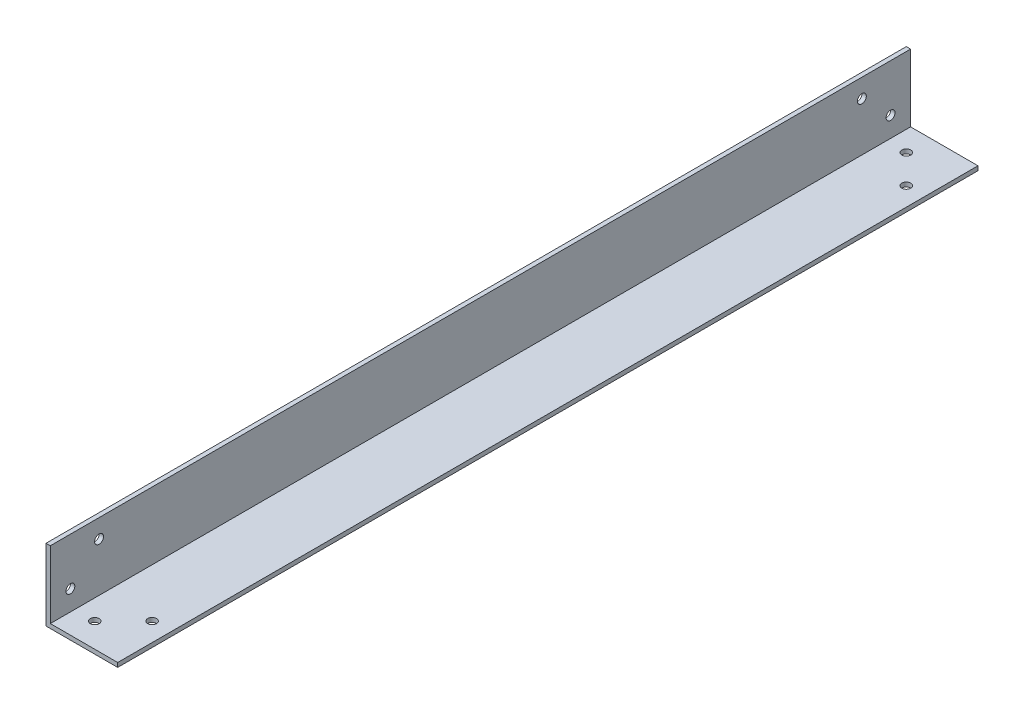
ISO-10303-21;
HEADER;
FILE_DESCRIPTION(('STEP AP214'),'2;1');
FILE_NAME('part.step','',(''),(''),'','','');
FILE_SCHEMA(('AUTOMOTIVE_DESIGN { 1 0 10303 214 1 1 1 1 }'));
ENDSEC;
DATA;
#1=APPLICATION_CONTEXT('core data for automotive mechanical design processes');
#2=APPLICATION_PROTOCOL_DEFINITION('international standard','automotive_design',2000,#1);
#3=PRODUCT_CONTEXT('',#1,'mechanical');
#4=PRODUCT('Part','Part','',(#3));
#5=PRODUCT_RELATED_PRODUCT_CATEGORY('part','',(#4));
#6=PRODUCT_DEFINITION_FORMATION('','',#4);
#7=PRODUCT_DEFINITION_CONTEXT('part definition',#1,'design');
#8=PRODUCT_DEFINITION('design','',#6,#7);
#9=PRODUCT_DEFINITION_SHAPE('','',#8);
#10=(LENGTH_UNIT() NAMED_UNIT(*) SI_UNIT(.MILLI.,.METRE.));
#11=(NAMED_UNIT(*) PLANE_ANGLE_UNIT() SI_UNIT($,.RADIAN.));
#12=(NAMED_UNIT(*) SI_UNIT($,.STERADIAN.) SOLID_ANGLE_UNIT());
#13=UNCERTAINTY_MEASURE_WITH_UNIT(LENGTH_MEASURE(1.E-05),#10,'distance_accuracy_value','');
#14=(GEOMETRIC_REPRESENTATION_CONTEXT(3) GLOBAL_UNCERTAINTY_ASSIGNED_CONTEXT((#13)) GLOBAL_UNIT_ASSIGNED_CONTEXT((#10,
#11,#12)) REPRESENTATION_CONTEXT('',''));
#15=CARTESIAN_POINT('',(0.,0.,0.));
#16=DIRECTION('',(0.,0.,1.));
#17=DIRECTION('',(1.,0.,0.));
#18=AXIS2_PLACEMENT_3D('',#15,#16,#17);
#19=CARTESIAN_POINT('',(25.,0.,300.));
#20=DIRECTION('',(0.,1.,0.));
#21=DIRECTION('',(-1.,0.,0.));
#22=AXIS2_PLACEMENT_3D('',#19,#20,#21);
#23=PLANE('',#22);
#24=CARTESIAN_POINT('',(8.50000000000004,0.,8.50000000000001));
#25=DIRECTION('',(0.,-1.,0.));
#26=DIRECTION('',(1.,0.,0.));
#27=AXIS2_PLACEMENT_3D('',#24,#25,#26);
#28=CIRCLE('',#27,1.55);
#29=CARTESIAN_POINT('',(10.05,0.,8.50000000000001));
#30=VERTEX_POINT('',#29);
#31=EDGE_CURVE('E155',#30,#30,#28,.T.);
#32=ORIENTED_EDGE('',*,*,#31,.F.);
#33=EDGE_LOOP('',(#32));
#34=FACE_BOUND('',#33,.T.);
#35=CARTESIAN_POINT('',(18.5,0.,18.5));
#36=DIRECTION('',(0.,-1.,0.));
#37=DIRECTION('',(1.,0.,0.));
#38=AXIS2_PLACEMENT_3D('',#35,#36,#37);
#39=CIRCLE('',#38,1.55);
#40=CARTESIAN_POINT('',(20.05,0.,18.5));
#41=VERTEX_POINT('',#40);
#42=EDGE_CURVE('E145',#41,#41,#39,.T.);
#43=ORIENTED_EDGE('',*,*,#42,.F.);
#44=EDGE_LOOP('',(#43));
#45=FACE_BOUND('',#44,.T.);
#46=CARTESIAN_POINT('',(8.5,0.,291.5));
#47=DIRECTION('',(0.,-1.,0.));
#48=DIRECTION('',(1.,0.,0.));
#49=AXIS2_PLACEMENT_3D('',#46,#47,#48);
#50=CIRCLE('',#49,1.55000000000002);
#51=CARTESIAN_POINT('',(10.05,0.,291.5));
#52=VERTEX_POINT('',#51);
#53=EDGE_CURVE('E142',#52,#52,#50,.T.);
#54=ORIENTED_EDGE('',*,*,#53,.F.);
#55=EDGE_LOOP('',(#54));
#56=FACE_BOUND('',#55,.T.);
#57=CARTESIAN_POINT('',(18.5,0.,281.5));
#58=DIRECTION('',(0.,-1.,0.));
#59=DIRECTION('',(1.,0.,0.));
#60=AXIS2_PLACEMENT_3D('',#57,#58,#59);
#61=CIRCLE('',#60,1.55000000000002);
#62=CARTESIAN_POINT('',(20.05,0.,281.5));
#63=VERTEX_POINT('',#62);
#64=EDGE_CURVE('E139',#63,#63,#61,.T.);
#65=ORIENTED_EDGE('',*,*,#64,.F.);
#66=EDGE_LOOP('',(#65));
#67=FACE_BOUND('',#66,.T.);
#68=DIRECTION('',(1.,0.,0.));
#69=VECTOR('',#68,1.);
#70=CARTESIAN_POINT('',(25.,0.,0.));
#71=LINE('',#70,#69);
#72=CARTESIAN_POINT('',(0.,0.,0.));
#73=VERTEX_POINT('',#72);
#74=CARTESIAN_POINT('',(25.,0.,0.));
#75=VERTEX_POINT('',#74);
#76=EDGE_CURVE('E118',#73,#75,#71,.T.);
#77=ORIENTED_EDGE('',*,*,#76,.T.);
#78=DIRECTION('',(0.,0.,-1.));
#79=VECTOR('',#78,1.);
#80=CARTESIAN_POINT('',(25.,0.,300.));
#81=LINE('',#80,#79);
#82=CARTESIAN_POINT('',(25.,0.,300.));
#83=VERTEX_POINT('',#82);
#84=EDGE_CURVE('E11',#83,#75,#81,.T.);
#85=ORIENTED_EDGE('',*,*,#84,.F.);
#86=DIRECTION('',(1.,0.,0.));
#87=VECTOR('',#86,1.);
#88=CARTESIAN_POINT('',(25.,0.,300.));
#89=LINE('',#88,#87);
#90=CARTESIAN_POINT('',(0.,0.,300.));
#91=VERTEX_POINT('',#90);
#92=EDGE_CURVE('E129',#91,#83,#89,.T.);
#93=ORIENTED_EDGE('',*,*,#92,.F.);
#94=DIRECTION('',(0.,0.,-1.));
#95=VECTOR('',#94,1.);
#96=CARTESIAN_POINT('',(0.,0.,300.));
#97=LINE('',#96,#95);
#98=EDGE_CURVE('E114',#91,#73,#97,.T.);
#99=ORIENTED_EDGE('',*,*,#98,.T.);
#100=EDGE_LOOP('',(#77,#85,#93,#99));
#101=FACE_BOUND('',#100,.T.);
#102=ADVANCED_FACE('F32',(#34,#45,#56,#67,#101),#23,.F.);
#103=CARTESIAN_POINT('',(25.,1.5,300.));
#104=DIRECTION('',(-1.,0.,0.));
#105=DIRECTION('',(0.,0.,1.));
#106=AXIS2_PLACEMENT_3D('',#103,#104,#105);
#107=PLANE('',#106);
#108=DIRECTION('',(0.,1.,0.));
#109=VECTOR('',#108,1.);
#110=CARTESIAN_POINT('',(25.,1.5,0.));
#111=LINE('',#110,#109);
#112=CARTESIAN_POINT('',(25.,1.5,0.));
#113=VERTEX_POINT('',#112);
#114=EDGE_CURVE('E121',#75,#113,#111,.T.);
#115=ORIENTED_EDGE('',*,*,#114,.T.);
#116=DIRECTION('',(0.,0.,-1.));
#117=VECTOR('',#116,1.);
#118=CARTESIAN_POINT('',(25.,1.5,300.));
#119=LINE('',#118,#117);
#120=CARTESIAN_POINT('',(25.,1.5,300.));
#121=VERTEX_POINT('',#120);
#122=EDGE_CURVE('E41',#121,#113,#119,.T.);
#123=ORIENTED_EDGE('',*,*,#122,.F.);
#124=DIRECTION('',(0.,1.,0.));
#125=VECTOR('',#124,1.);
#126=CARTESIAN_POINT('',(25.,1.5,300.));
#127=LINE('',#126,#125);
#128=EDGE_CURVE('E87',#83,#121,#127,.T.);
#129=ORIENTED_EDGE('',*,*,#128,.F.);
#130=ORIENTED_EDGE('',*,*,#84,.T.);
#131=EDGE_LOOP('',(#115,#123,#129,#130));
#132=FACE_BOUND('',#131,.T.);
#133=ADVANCED_FACE('F185',(#132),#107,.F.);
#134=CARTESIAN_POINT('',(1.5,1.5,300.));
#135=DIRECTION('',(0.,-1.,0.));
#136=DIRECTION('',(1.,0.,0.));
#137=AXIS2_PLACEMENT_3D('',#134,#135,#136);
#138=PLANE('',#137);
#139=CARTESIAN_POINT('',(8.50000000000004,1.5,8.50000000000001));
#140=DIRECTION('',(0.,-1.,0.));
#141=DIRECTION('',(1.,0.,0.));
#142=AXIS2_PLACEMENT_3D('',#139,#140,#141);
#143=CIRCLE('',#142,1.55);
#144=CARTESIAN_POINT('',(10.05,1.5,8.50000000000001));
#145=VERTEX_POINT('',#144);
#146=EDGE_CURVE('E35',#145,#145,#143,.T.);
#147=ORIENTED_EDGE('',*,*,#146,.T.);
#148=EDGE_LOOP('',(#147));
#149=FACE_BOUND('',#148,.T.);
#150=CARTESIAN_POINT('',(18.5,1.5,18.5));
#151=DIRECTION('',(0.,-1.,0.));
#152=DIRECTION('',(1.,0.,0.));
#153=AXIS2_PLACEMENT_3D('',#150,#151,#152);
#154=CIRCLE('',#153,1.55);
#155=CARTESIAN_POINT('',(20.05,1.5,18.5));
#156=VERTEX_POINT('',#155);
#157=EDGE_CURVE('E143',#156,#156,#154,.T.);
#158=ORIENTED_EDGE('',*,*,#157,.T.);
#159=EDGE_LOOP('',(#158));
#160=FACE_BOUND('',#159,.T.);
#161=CARTESIAN_POINT('',(8.5,1.5,291.5));
#162=DIRECTION('',(0.,-1.,0.));
#163=DIRECTION('',(1.,0.,0.));
#164=AXIS2_PLACEMENT_3D('',#161,#162,#163);
#165=CIRCLE('',#164,1.55000000000002);
#166=CARTESIAN_POINT('',(10.05,1.5,291.5));
#167=VERTEX_POINT('',#166);
#168=EDGE_CURVE('E140',#167,#167,#165,.T.);
#169=ORIENTED_EDGE('',*,*,#168,.T.);
#170=EDGE_LOOP('',(#169));
#171=FACE_BOUND('',#170,.T.);
#172=CARTESIAN_POINT('',(18.5,1.5,281.5));
#173=DIRECTION('',(0.,-1.,0.));
#174=DIRECTION('',(1.,0.,0.));
#175=AXIS2_PLACEMENT_3D('',#172,#173,#174);
#176=CIRCLE('',#175,1.55000000000002);
#177=CARTESIAN_POINT('',(20.05,1.5,281.5));
#178=VERTEX_POINT('',#177);
#179=EDGE_CURVE('E135',#178,#178,#176,.T.);
#180=ORIENTED_EDGE('',*,*,#179,.T.);
#181=EDGE_LOOP('',(#180));
#182=FACE_BOUND('',#181,.T.);
#183=DIRECTION('',(-1.,0.,0.));
#184=VECTOR('',#183,1.);
#185=CARTESIAN_POINT('',(1.5,1.5,0.));
#186=LINE('',#185,#184);
#187=CARTESIAN_POINT('',(1.5,1.5,0.));
#188=VERTEX_POINT('',#187);
#189=EDGE_CURVE('E124',#113,#188,#186,.T.);
#190=ORIENTED_EDGE('',*,*,#189,.T.);
#191=DIRECTION('',(0.,0.,-1.));
#192=VECTOR('',#191,1.);
#193=CARTESIAN_POINT('',(1.5,1.5,300.));
#194=LINE('',#193,#192);
#195=CARTESIAN_POINT('',(1.5,1.5,300.));
#196=VERTEX_POINT('',#195);
#197=EDGE_CURVE('E109',#196,#188,#194,.T.);
#198=ORIENTED_EDGE('',*,*,#197,.F.);
#199=DIRECTION('',(-1.,0.,0.));
#200=VECTOR('',#199,1.);
#201=CARTESIAN_POINT('',(1.5,1.5,300.));
#202=LINE('',#201,#200);
#203=EDGE_CURVE('E100',#121,#196,#202,.T.);
#204=ORIENTED_EDGE('',*,*,#203,.F.);
#205=ORIENTED_EDGE('',*,*,#122,.T.);
#206=EDGE_LOOP('',(#190,#198,#204,#205));
#207=FACE_BOUND('',#206,.T.);
#208=ADVANCED_FACE('F188',(#149,#160,#171,#182,#207),#138,.F.);
#209=CARTESIAN_POINT('',(1.5,25.,300.));
#210=DIRECTION('',(-1.,0.,0.));
#211=DIRECTION('',(0.,-1.,0.));
#212=AXIS2_PLACEMENT_3D('',#209,#210,#211);
#213=PLANE('',#212);
#214=CARTESIAN_POINT('',(1.5,8.49999999999997,7.00000000000001));
#215=DIRECTION('',(-1.,0.,0.));
#216=DIRECTION('',(0.,-1.,0.));
#217=AXIS2_PLACEMENT_3D('',#214,#215,#216);
#218=CIRCLE('',#217,1.55);
#219=CARTESIAN_POINT('',(1.5,6.94999999999996,7.00000000000001));
#220=VERTEX_POINT('',#219);
#221=EDGE_CURVE('E162',#220,#220,#218,.T.);
#222=ORIENTED_EDGE('',*,*,#221,.T.);
#223=EDGE_LOOP('',(#222));
#224=FACE_BOUND('',#223,.T.);
#225=CARTESIAN_POINT('',(1.5,18.5,17.));
#226=DIRECTION('',(-1.,0.,0.));
#227=DIRECTION('',(0.,-1.,0.));
#228=AXIS2_PLACEMENT_3D('',#225,#226,#227);
#229=CIRCLE('',#228,1.55);
#230=CARTESIAN_POINT('',(1.5,16.95,17.));
#231=VERTEX_POINT('',#230);
#232=EDGE_CURVE('E168',#231,#231,#229,.T.);
#233=ORIENTED_EDGE('',*,*,#232,.T.);
#234=EDGE_LOOP('',(#233));
#235=FACE_BOUND('',#234,.T.);
#236=CARTESIAN_POINT('',(1.5,8.5,293.));
#237=DIRECTION('',(-1.,0.,0.));
#238=DIRECTION('',(0.,-1.,0.));
#239=AXIS2_PLACEMENT_3D('',#236,#237,#238);
#240=CIRCLE('',#239,1.54999999999999);
#241=CARTESIAN_POINT('',(1.5,6.95000000000001,293.));
#242=VERTEX_POINT('',#241);
#243=EDGE_CURVE('E174',#242,#242,#240,.T.);
#244=ORIENTED_EDGE('',*,*,#243,.T.);
#245=EDGE_LOOP('',(#244));
#246=FACE_BOUND('',#245,.T.);
#247=CARTESIAN_POINT('',(1.5,18.5,283.));
#248=DIRECTION('',(-1.,0.,0.));
#249=DIRECTION('',(0.,-1.,0.));
#250=AXIS2_PLACEMENT_3D('',#247,#248,#249);
#251=CIRCLE('',#250,1.54999999999999);
#252=CARTESIAN_POINT('',(1.5,16.95,283.));
#253=VERTEX_POINT('',#252);
#254=EDGE_CURVE('E122',#253,#253,#251,.T.);
#255=ORIENTED_EDGE('',*,*,#254,.T.);
#256=EDGE_LOOP('',(#255));
#257=FACE_BOUND('',#256,.T.);
#258=DIRECTION('',(0.,1.,0.));
#259=VECTOR('',#258,1.);
#260=CARTESIAN_POINT('',(1.5,25.,0.));
#261=LINE('',#260,#259);
#262=CARTESIAN_POINT('',(1.5,25.,0.));
#263=VERTEX_POINT('',#262);
#264=EDGE_CURVE('E108',#188,#263,#261,.T.);
#265=ORIENTED_EDGE('',*,*,#264,.T.);
#266=DIRECTION('',(0.,0.,-1.));
#267=VECTOR('',#266,1.);
#268=CARTESIAN_POINT('',(1.5,25.,300.));
#269=LINE('',#268,#267);
#270=CARTESIAN_POINT('',(1.5,25.,300.));
#271=VERTEX_POINT('',#270);
#272=EDGE_CURVE('E105',#271,#263,#269,.T.);
#273=ORIENTED_EDGE('',*,*,#272,.F.);
#274=DIRECTION('',(0.,1.,0.));
#275=VECTOR('',#274,1.);
#276=CARTESIAN_POINT('',(1.5,25.,300.));
#277=LINE('',#276,#275);
#278=EDGE_CURVE('E94',#196,#271,#277,.T.);
#279=ORIENTED_EDGE('',*,*,#278,.F.);
#280=ORIENTED_EDGE('',*,*,#197,.T.);
#281=EDGE_LOOP('',(#265,#273,#279,#280));
#282=FACE_BOUND('',#281,.T.);
#283=ADVANCED_FACE('F106',(#224,#235,#246,#257,#282),#213,.F.);
#284=CARTESIAN_POINT('',(0.,25.,300.));
#285=DIRECTION('',(0.,-1.,0.));
#286=DIRECTION('',(0.,0.,-1.));
#287=AXIS2_PLACEMENT_3D('',#284,#285,#286);
#288=PLANE('',#287);
#289=DIRECTION('',(-1.,0.,0.));
#290=VECTOR('',#289,1.);
#291=CARTESIAN_POINT('',(0.,25.,0.));
#292=LINE('',#291,#290);
#293=CARTESIAN_POINT('',(0.,25.,0.));
#294=VERTEX_POINT('',#293);
#295=EDGE_CURVE('E73',#263,#294,#292,.T.);
#296=ORIENTED_EDGE('',*,*,#295,.T.);
#297=DIRECTION('',(0.,0.,-1.));
#298=VECTOR('',#297,1.);
#299=CARTESIAN_POINT('',(0.,25.,300.));
#300=LINE('',#299,#298);
#301=CARTESIAN_POINT('',(0.,25.,300.));
#302=VERTEX_POINT('',#301);
#303=EDGE_CURVE('E110',#302,#294,#300,.T.);
#304=ORIENTED_EDGE('',*,*,#303,.F.);
#305=DIRECTION('',(-1.,0.,0.));
#306=VECTOR('',#305,1.);
#307=CARTESIAN_POINT('',(0.,25.,300.));
#308=LINE('',#307,#306);
#309=EDGE_CURVE('E98',#271,#302,#308,.T.);
#310=ORIENTED_EDGE('',*,*,#309,.F.);
#311=ORIENTED_EDGE('',*,*,#272,.T.);
#312=EDGE_LOOP('',(#296,#304,#310,#311));
#313=FACE_BOUND('',#312,.T.);
#314=ADVANCED_FACE('F112',(#313),#288,.F.);
#315=CARTESIAN_POINT('',(0.,0.,300.));
#316=DIRECTION('',(1.,0.,0.));
#317=DIRECTION('',(0.,0.,-1.));
#318=AXIS2_PLACEMENT_3D('',#315,#316,#317);
#319=PLANE('',#318);
#320=CARTESIAN_POINT('',(0.,8.49999999999997,7.00000000000001));
#321=DIRECTION('',(-1.,0.,0.));
#322=DIRECTION('',(0.,0.,1.));
#323=AXIS2_PLACEMENT_3D('',#320,#321,#322);
#324=CIRCLE('',#323,1.55);
#325=CARTESIAN_POINT('',(0.,8.49999999999997,8.55000000000001));
#326=VERTEX_POINT('',#325);
#327=EDGE_CURVE('E138',#326,#326,#324,.T.);
#328=ORIENTED_EDGE('',*,*,#327,.F.);
#329=EDGE_LOOP('',(#328));
#330=FACE_BOUND('',#329,.T.);
#331=CARTESIAN_POINT('',(0.,18.5,17.));
#332=DIRECTION('',(-1.,0.,0.));
#333=DIRECTION('',(0.,0.,1.));
#334=AXIS2_PLACEMENT_3D('',#331,#332,#333);
#335=CIRCLE('',#334,1.55);
#336=CARTESIAN_POINT('',(0.,18.5,18.55));
#337=VERTEX_POINT('',#336);
#338=EDGE_CURVE('E165',#337,#337,#335,.T.);
#339=ORIENTED_EDGE('',*,*,#338,.F.);
#340=EDGE_LOOP('',(#339));
#341=FACE_BOUND('',#340,.T.);
#342=CARTESIAN_POINT('',(0.,8.5,293.));
#343=DIRECTION('',(-1.,0.,0.));
#344=DIRECTION('',(0.,0.,1.));
#345=AXIS2_PLACEMENT_3D('',#342,#343,#344);
#346=CIRCLE('',#345,1.54999999999999);
#347=CARTESIAN_POINT('',(0.,8.5,294.55));
#348=VERTEX_POINT('',#347);
#349=EDGE_CURVE('E171',#348,#348,#346,.T.);
#350=ORIENTED_EDGE('',*,*,#349,.F.);
#351=EDGE_LOOP('',(#350));
#352=FACE_BOUND('',#351,.T.);
#353=CARTESIAN_POINT('',(0.,18.5,283.));
#354=DIRECTION('',(-1.,0.,0.));
#355=DIRECTION('',(0.,0.,1.));
#356=AXIS2_PLACEMENT_3D('',#353,#354,#355);
#357=CIRCLE('',#356,1.54999999999999);
#358=CARTESIAN_POINT('',(0.,18.5,284.55));
#359=VERTEX_POINT('',#358);
#360=EDGE_CURVE('E177',#359,#359,#357,.T.);
#361=ORIENTED_EDGE('',*,*,#360,.F.);
#362=EDGE_LOOP('',(#361));
#363=FACE_BOUND('',#362,.T.);
#364=DIRECTION('',(0.,-1.,0.));
#365=VECTOR('',#364,1.);
#366=CARTESIAN_POINT('',(0.,0.,0.));
#367=LINE('',#366,#365);
#368=EDGE_CURVE('E79',#294,#73,#367,.T.);
#369=ORIENTED_EDGE('',*,*,#368,.T.);
#370=ORIENTED_EDGE('',*,*,#98,.F.);
#371=DIRECTION('',(0.,-1.,0.));
#372=VECTOR('',#371,1.);
#373=CARTESIAN_POINT('',(0.,0.,300.));
#374=LINE('',#373,#372);
#375=EDGE_CURVE('E50',#302,#91,#374,.T.);
#376=ORIENTED_EDGE('',*,*,#375,.F.);
#377=ORIENTED_EDGE('',*,*,#303,.T.);
#378=EDGE_LOOP('',(#369,#370,#376,#377));
#379=FACE_BOUND('',#378,.T.);
#380=ADVANCED_FACE('F193',(#330,#341,#352,#363,#379),#319,.F.);
#381=CARTESIAN_POINT('',(0.,0.,300.));
#382=DIRECTION('',(0.,0.,-1.));
#383=DIRECTION('',(-1.,0.,0.));
#384=AXIS2_PLACEMENT_3D('',#381,#382,#383);
#385=PLANE('',#384);
#386=ORIENTED_EDGE('',*,*,#92,.T.);
#387=ORIENTED_EDGE('',*,*,#128,.T.);
#388=ORIENTED_EDGE('',*,*,#203,.T.);
#389=ORIENTED_EDGE('',*,*,#278,.T.);
#390=ORIENTED_EDGE('',*,*,#309,.T.);
#391=ORIENTED_EDGE('',*,*,#375,.T.);
#392=EDGE_LOOP('',(#386,#387,#388,#389,#390,#391));
#393=FACE_BOUND('',#392,.T.);
#394=ADVANCED_FACE('F96',(#393),#385,.F.);
#395=CARTESIAN_POINT('',(0.,0.,0.));
#396=DIRECTION('',(0.,0.,-1.));
#397=DIRECTION('',(-1.,0.,0.));
#398=AXIS2_PLACEMENT_3D('',#395,#396,#397);
#399=PLANE('',#398);
#400=ORIENTED_EDGE('',*,*,#76,.F.);
#401=ORIENTED_EDGE('',*,*,#368,.F.);
#402=ORIENTED_EDGE('',*,*,#295,.F.);
#403=ORIENTED_EDGE('',*,*,#264,.F.);
#404=ORIENTED_EDGE('',*,*,#189,.F.);
#405=ORIENTED_EDGE('',*,*,#114,.F.);
#406=EDGE_LOOP('',(#400,#401,#402,#403,#404,#405));
#407=FACE_BOUND('',#406,.T.);
#408=ADVANCED_FACE('F191',(#407),#399,.T.);
#409=CARTESIAN_POINT('',(10.,18.5,283.));
#410=DIRECTION('',(-1.,0.,0.));
#411=DIRECTION('',(0.,0.,1.));
#412=AXIS2_PLACEMENT_3D('',#409,#410,#411);
#413=CYLINDRICAL_SURFACE('',#412,1.54999999999999);
#414=ORIENTED_EDGE('',*,*,#360,.T.);
#415=EDGE_LOOP('',(#414));
#416=FACE_BOUND('',#415,.T.);
#417=ORIENTED_EDGE('',*,*,#254,.F.);
#418=EDGE_LOOP('',(#417));
#419=FACE_BOUND('',#418,.T.);
#420=ADVANCED_FACE('F260',(#416,#419),#413,.F.);
#421=CARTESIAN_POINT('',(10.,8.5,293.));
#422=DIRECTION('',(-1.,0.,0.));
#423=DIRECTION('',(0.,0.,1.));
#424=AXIS2_PLACEMENT_3D('',#421,#422,#423);
#425=CYLINDRICAL_SURFACE('',#424,1.54999999999999);
#426=ORIENTED_EDGE('',*,*,#349,.T.);
#427=EDGE_LOOP('',(#426));
#428=FACE_BOUND('',#427,.T.);
#429=ORIENTED_EDGE('',*,*,#243,.F.);
#430=EDGE_LOOP('',(#429));
#431=FACE_BOUND('',#430,.T.);
#432=ADVANCED_FACE('F256',(#428,#431),#425,.F.);
#433=CARTESIAN_POINT('',(10.,18.5,17.));
#434=DIRECTION('',(-1.,0.,0.));
#435=DIRECTION('',(0.,0.,1.));
#436=AXIS2_PLACEMENT_3D('',#433,#434,#435);
#437=CYLINDRICAL_SURFACE('',#436,1.55);
#438=ORIENTED_EDGE('',*,*,#338,.T.);
#439=EDGE_LOOP('',(#438));
#440=FACE_BOUND('',#439,.T.);
#441=ORIENTED_EDGE('',*,*,#232,.F.);
#442=EDGE_LOOP('',(#441));
#443=FACE_BOUND('',#442,.T.);
#444=ADVANCED_FACE('F252',(#440,#443),#437,.F.);
#445=CARTESIAN_POINT('',(10.,8.49999999999997,7.00000000000001));
#446=DIRECTION('',(-1.,0.,0.));
#447=DIRECTION('',(0.,0.,1.));
#448=AXIS2_PLACEMENT_3D('',#445,#446,#447);
#449=CYLINDRICAL_SURFACE('',#448,1.55);
#450=ORIENTED_EDGE('',*,*,#327,.T.);
#451=EDGE_LOOP('',(#450));
#452=FACE_BOUND('',#451,.T.);
#453=ORIENTED_EDGE('',*,*,#221,.F.);
#454=EDGE_LOOP('',(#453));
#455=FACE_BOUND('',#454,.T.);
#456=ADVANCED_FACE('F223',(#452,#455),#449,.F.);
#457=CARTESIAN_POINT('',(18.5,10.,281.5));
#458=DIRECTION('',(0.,-1.,0.));
#459=DIRECTION('',(1.,0.,0.));
#460=AXIS2_PLACEMENT_3D('',#457,#458,#459);
#461=CYLINDRICAL_SURFACE('',#460,1.55000000000002);
#462=ORIENTED_EDGE('',*,*,#64,.T.);
#463=EDGE_LOOP('',(#462));
#464=FACE_BOUND('',#463,.T.);
#465=ORIENTED_EDGE('',*,*,#179,.F.);
#466=EDGE_LOOP('',(#465));
#467=FACE_BOUND('',#466,.T.);
#468=ADVANCED_FACE('F219',(#464,#467),#461,.F.);
#469=CARTESIAN_POINT('',(8.5,10.,291.5));
#470=DIRECTION('',(0.,-1.,0.));
#471=DIRECTION('',(1.,0.,0.));
#472=AXIS2_PLACEMENT_3D('',#469,#470,#471);
#473=CYLINDRICAL_SURFACE('',#472,1.55000000000002);
#474=ORIENTED_EDGE('',*,*,#53,.T.);
#475=EDGE_LOOP('',(#474));
#476=FACE_BOUND('',#475,.T.);
#477=ORIENTED_EDGE('',*,*,#168,.F.);
#478=EDGE_LOOP('',(#477));
#479=FACE_BOUND('',#478,.T.);
#480=ADVANCED_FACE('F222',(#476,#479),#473,.F.);
#481=CARTESIAN_POINT('',(18.5,10.,18.5));
#482=DIRECTION('',(0.,-1.,0.));
#483=DIRECTION('',(1.,0.,0.));
#484=AXIS2_PLACEMENT_3D('',#481,#482,#483);
#485=CYLINDRICAL_SURFACE('',#484,1.55);
#486=ORIENTED_EDGE('',*,*,#42,.T.);
#487=EDGE_LOOP('',(#486));
#488=FACE_BOUND('',#487,.T.);
#489=ORIENTED_EDGE('',*,*,#157,.F.);
#490=EDGE_LOOP('',(#489));
#491=FACE_BOUND('',#490,.T.);
#492=ADVANCED_FACE('F240',(#488,#491),#485,.F.);
#493=CARTESIAN_POINT('',(8.50000000000004,10.,8.50000000000001));
#494=DIRECTION('',(0.,-1.,0.));
#495=DIRECTION('',(1.,0.,0.));
#496=AXIS2_PLACEMENT_3D('',#493,#494,#495);
#497=CYLINDRICAL_SURFACE('',#496,1.55);
#498=ORIENTED_EDGE('',*,*,#31,.T.);
#499=EDGE_LOOP('',(#498));
#500=FACE_BOUND('',#499,.T.);
#501=ORIENTED_EDGE('',*,*,#146,.F.);
#502=EDGE_LOOP('',(#501));
#503=FACE_BOUND('',#502,.T.);
#504=ADVANCED_FACE('F246',(#500,#503),#497,.F.);
#505=CLOSED_SHELL('',(#102,#133,#208,#283,#314,#380,#394,#408,#420,#432,#444,#456,#468,#480,
#492,#504));
#506=MANIFOLD_SOLID_BREP('B2',#505);
#507=ADVANCED_BREP_SHAPE_REPRESENTATION('',(#18,#506),#14);
#508=SHAPE_DEFINITION_REPRESENTATION(#9,#507);
ENDSEC;
END-ISO-10303-21;
